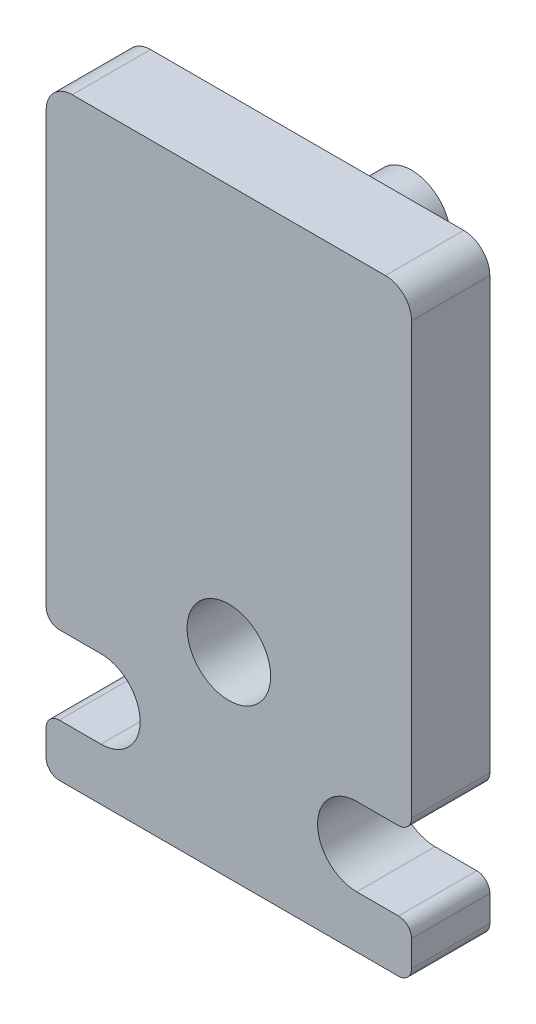
ISO-10303-21;
HEADER;
FILE_DESCRIPTION(('STEP AP214'),'2;1');
FILE_NAME('part.step','',(''),(''),'','','');
FILE_SCHEMA(('AUTOMOTIVE_DESIGN { 1 0 10303 214 1 1 1 1 }'));
ENDSEC;
DATA;
#1=APPLICATION_CONTEXT('core data for automotive mechanical design processes');
#2=APPLICATION_PROTOCOL_DEFINITION('international standard','automotive_design',2000,#1);
#3=PRODUCT_CONTEXT('',#1,'mechanical');
#4=PRODUCT('Part','Part','',(#3));
#5=PRODUCT_RELATED_PRODUCT_CATEGORY('part','',(#4));
#6=PRODUCT_DEFINITION_FORMATION('','',#4);
#7=PRODUCT_DEFINITION_CONTEXT('part definition',#1,'design');
#8=PRODUCT_DEFINITION('design','',#6,#7);
#9=PRODUCT_DEFINITION_SHAPE('','',#8);
#10=(LENGTH_UNIT() NAMED_UNIT(*) SI_UNIT(.MILLI.,.METRE.));
#11=(NAMED_UNIT(*) PLANE_ANGLE_UNIT() SI_UNIT($,.RADIAN.));
#12=(NAMED_UNIT(*) SI_UNIT($,.STERADIAN.) SOLID_ANGLE_UNIT());
#13=UNCERTAINTY_MEASURE_WITH_UNIT(LENGTH_MEASURE(1.E-05),#10,'distance_accuracy_value','');
#14=(GEOMETRIC_REPRESENTATION_CONTEXT(3) GLOBAL_UNCERTAINTY_ASSIGNED_CONTEXT((#13)) GLOBAL_UNIT_ASSIGNED_CONTEXT((#10,
#11,#12)) REPRESENTATION_CONTEXT('',''));
#15=CARTESIAN_POINT('',(0.,0.,0.));
#16=DIRECTION('',(0.,0.,1.));
#17=DIRECTION('',(1.,0.,0.));
#18=AXIS2_PLACEMENT_3D('',#15,#16,#17);
#19=CARTESIAN_POINT('',(-4.90000000000001,-8.00000000000001,1.5));
#20=DIRECTION('',(0.,0.,1.));
#21=DIRECTION('',(1.,0.,0.));
#22=AXIS2_PLACEMENT_3D('',#19,#20,#21);
#23=PLANE('',#22);
#24=DIRECTION('',(1.,0.,0.));
#25=VECTOR('',#24,1.);
#26=CARTESIAN_POINT('',(-7.,-11.5,1.5));
#27=LINE('',#26,#25);
#28=CARTESIAN_POINT('',(-6.5,-11.5,1.5));
#29=VERTEX_POINT('',#28);
#30=CARTESIAN_POINT('',(6.5,-11.5,1.5));
#31=VERTEX_POINT('',#30);
#32=EDGE_CURVE('E220',#29,#31,#27,.T.);
#33=ORIENTED_EDGE('',*,*,#32,.T.);
#34=CARTESIAN_POINT('',(6.5,-11.,1.5));
#35=DIRECTION('',(0.,0.,1.));
#36=DIRECTION('',(1.,0.,0.));
#37=AXIS2_PLACEMENT_3D('',#34,#35,#36);
#38=CIRCLE('',#37,0.5);
#39=CARTESIAN_POINT('',(7.,-11.,1.5));
#40=VERTEX_POINT('',#39);
#41=EDGE_CURVE('E308',#31,#40,#38,.T.);
#42=ORIENTED_EDGE('',*,*,#41,.T.);
#43=DIRECTION('',(0.,1.,0.));
#44=VECTOR('',#43,1.);
#45=CARTESIAN_POINT('',(7.,-9.5,1.5));
#46=LINE('',#45,#44);
#47=CARTESIAN_POINT('',(7.,-10.,1.5));
#48=VERTEX_POINT('',#47);
#49=EDGE_CURVE('E183',#40,#48,#46,.T.);
#50=ORIENTED_EDGE('',*,*,#49,.T.);
#51=CARTESIAN_POINT('',(6.5,-10.,1.5));
#52=DIRECTION('',(0.,0.,1.));
#53=DIRECTION('',(1.,0.,0.));
#54=AXIS2_PLACEMENT_3D('',#51,#52,#53);
#55=CIRCLE('',#54,0.5);
#56=CARTESIAN_POINT('',(6.5,-9.5,1.5));
#57=VERTEX_POINT('',#56);
#58=EDGE_CURVE('E179',#48,#57,#55,.T.);
#59=ORIENTED_EDGE('',*,*,#58,.T.);
#60=DIRECTION('',(-1.,0.,0.));
#61=VECTOR('',#60,1.);
#62=CARTESIAN_POINT('',(4.90000000000001,-9.5,1.5));
#63=LINE('',#62,#61);
#64=CARTESIAN_POINT('',(4.90000000000001,-9.5,1.5));
#65=VERTEX_POINT('',#64);
#66=EDGE_CURVE('E170',#57,#65,#63,.T.);
#67=ORIENTED_EDGE('',*,*,#66,.T.);
#68=CARTESIAN_POINT('',(4.89999999999999,-8.,1.5));
#69=DIRECTION('',(0.,0.,-1.));
#70=DIRECTION('',(1.,0.,0.));
#71=AXIS2_PLACEMENT_3D('',#68,#69,#70);
#72=CIRCLE('',#71,1.5);
#73=CARTESIAN_POINT('',(4.90000000000001,-6.5,1.5));
#74=VERTEX_POINT('',#73);
#75=EDGE_CURVE('E175',#65,#74,#72,.T.);
#76=ORIENTED_EDGE('',*,*,#75,.T.);
#77=DIRECTION('',(1.,0.,0.));
#78=VECTOR('',#77,1.);
#79=CARTESIAN_POINT('',(4.90000000000001,-6.5,1.5));
#80=LINE('',#79,#78);
#81=CARTESIAN_POINT('',(6.5,-6.5,1.5));
#82=VERTEX_POINT('',#81);
#83=EDGE_CURVE('E197',#74,#82,#80,.T.);
#84=ORIENTED_EDGE('',*,*,#83,.T.);
#85=CARTESIAN_POINT('',(6.5,-6.,1.5));
#86=DIRECTION('',(0.,0.,1.));
#87=DIRECTION('',(1.,0.,0.));
#88=AXIS2_PLACEMENT_3D('',#85,#86,#87);
#89=CIRCLE('',#88,0.5);
#90=CARTESIAN_POINT('',(7.,-6.,1.5));
#91=VERTEX_POINT('',#90);
#92=EDGE_CURVE('E48',#82,#91,#89,.T.);
#93=ORIENTED_EDGE('',*,*,#92,.T.);
#94=DIRECTION('',(0.,1.,0.));
#95=VECTOR('',#94,1.);
#96=CARTESIAN_POINT('',(7.,11.5,1.5));
#97=LINE('',#96,#95);
#98=CARTESIAN_POINT('',(7.,10.5,1.5));
#99=VERTEX_POINT('',#98);
#100=EDGE_CURVE('E199',#91,#99,#97,.T.);
#101=ORIENTED_EDGE('',*,*,#100,.T.);
#102=CARTESIAN_POINT('',(6.,10.5,1.5));
#103=DIRECTION('',(0.,0.,1.));
#104=DIRECTION('',(1.,0.,0.));
#105=AXIS2_PLACEMENT_3D('',#102,#103,#104);
#106=CIRCLE('',#105,1.);
#107=CARTESIAN_POINT('',(6.,11.5,1.5));
#108=VERTEX_POINT('',#107);
#109=EDGE_CURVE('E271',#99,#108,#106,.T.);
#110=ORIENTED_EDGE('',*,*,#109,.T.);
#111=DIRECTION('',(-1.,0.,0.));
#112=VECTOR('',#111,1.);
#113=CARTESIAN_POINT('',(3.,11.5,1.5));
#114=LINE('',#113,#112);
#115=CARTESIAN_POINT('',(-6.,11.5,1.5));
#116=VERTEX_POINT('',#115);
#117=EDGE_CURVE('E204',#108,#116,#114,.T.);
#118=ORIENTED_EDGE('',*,*,#117,.T.);
#119=CARTESIAN_POINT('',(-6.,10.5,1.5));
#120=DIRECTION('',(0.,0.,1.));
#121=DIRECTION('',(1.,0.,0.));
#122=AXIS2_PLACEMENT_3D('',#119,#120,#121);
#123=CIRCLE('',#122,1.);
#124=CARTESIAN_POINT('',(-7.,10.5,1.5));
#125=VERTEX_POINT('',#124);
#126=EDGE_CURVE('E273',#116,#125,#123,.T.);
#127=ORIENTED_EDGE('',*,*,#126,.T.);
#128=DIRECTION('',(0.,-1.,0.));
#129=VECTOR('',#128,1.);
#130=CARTESIAN_POINT('',(-7.,11.5,1.5));
#131=LINE('',#130,#129);
#132=CARTESIAN_POINT('',(-7.,-5.99999999999999,1.5));
#133=VERTEX_POINT('',#132);
#134=EDGE_CURVE('E207',#125,#133,#131,.T.);
#135=ORIENTED_EDGE('',*,*,#134,.T.);
#136=CARTESIAN_POINT('',(-6.5,-5.99999999999999,1.5));
#137=DIRECTION('',(0.,0.,1.));
#138=DIRECTION('',(1.,0.,0.));
#139=AXIS2_PLACEMENT_3D('',#136,#137,#138);
#140=CIRCLE('',#139,0.5);
#141=CARTESIAN_POINT('',(-6.5,-6.5,1.5));
#142=VERTEX_POINT('',#141);
#143=EDGE_CURVE('E300',#133,#142,#140,.T.);
#144=ORIENTED_EDGE('',*,*,#143,.T.);
#145=DIRECTION('',(1.,0.,0.));
#146=VECTOR('',#145,1.);
#147=CARTESIAN_POINT('',(-4.90000000000001,-6.5,1.5));
#148=LINE('',#147,#146);
#149=CARTESIAN_POINT('',(-4.90000000000001,-6.5,1.5));
#150=VERTEX_POINT('',#149);
#151=EDGE_CURVE('E210',#142,#150,#148,.T.);
#152=ORIENTED_EDGE('',*,*,#151,.T.);
#153=CARTESIAN_POINT('',(-4.90000000000001,-8.00000000000001,1.5));
#154=DIRECTION('',(0.,0.,-1.));
#155=DIRECTION('',(1.,0.,0.));
#156=AXIS2_PLACEMENT_3D('',#153,#154,#155);
#157=CIRCLE('',#156,1.5);
#158=CARTESIAN_POINT('',(-4.90000000000001,-9.50000000000001,1.5));
#159=VERTEX_POINT('',#158);
#160=EDGE_CURVE('E212',#150,#159,#157,.T.);
#161=ORIENTED_EDGE('',*,*,#160,.T.);
#162=DIRECTION('',(-1.,0.,0.));
#163=VECTOR('',#162,1.);
#164=CARTESIAN_POINT('',(-4.90000000000001,-9.50000000000001,1.5));
#165=LINE('',#164,#163);
#166=CARTESIAN_POINT('',(-6.5,-9.50000000000001,1.5));
#167=VERTEX_POINT('',#166);
#168=EDGE_CURVE('E214',#159,#167,#165,.T.);
#169=ORIENTED_EDGE('',*,*,#168,.T.);
#170=CARTESIAN_POINT('',(-6.5,-10.,1.5));
#171=DIRECTION('',(0.,0.,1.));
#172=DIRECTION('',(1.,0.,0.));
#173=AXIS2_PLACEMENT_3D('',#170,#171,#172);
#174=CIRCLE('',#173,0.5);
#175=CARTESIAN_POINT('',(-7.,-10.,1.5));
#176=VERTEX_POINT('',#175);
#177=EDGE_CURVE('E302',#167,#176,#174,.T.);
#178=ORIENTED_EDGE('',*,*,#177,.T.);
#179=DIRECTION('',(0.,-1.,0.));
#180=VECTOR('',#179,1.);
#181=CARTESIAN_POINT('',(-7.,-9.50000000000001,1.5));
#182=LINE('',#181,#180);
#183=CARTESIAN_POINT('',(-7.,-11.,1.5));
#184=VERTEX_POINT('',#183);
#185=EDGE_CURVE('E217',#176,#184,#182,.T.);
#186=ORIENTED_EDGE('',*,*,#185,.T.);
#187=CARTESIAN_POINT('',(-6.5,-11.,1.5));
#188=DIRECTION('',(0.,0.,1.));
#189=DIRECTION('',(1.,0.,0.));
#190=AXIS2_PLACEMENT_3D('',#187,#188,#189);
#191=CIRCLE('',#190,0.5);
#192=EDGE_CURVE('E306',#184,#29,#191,.T.);
#193=ORIENTED_EDGE('',*,*,#192,.T.);
#194=EDGE_LOOP('',(#33,#42,#50,#59,#67,#76,#84,#93,#101,#110,#118,#127,#135,#144,#152,#161,#169,
#178,#186,#193));
#195=FACE_BOUND('',#194,.T.);
#196=CARTESIAN_POINT('',(0.,-4.,1.5));
#197=DIRECTION('',(0.,0.,1.));
#198=DIRECTION('',(1.,0.,0.));
#199=AXIS2_PLACEMENT_3D('',#196,#197,#198);
#200=CIRCLE('',#199,1.6);
#201=CARTESIAN_POINT('',(1.6,-4.,1.5));
#202=VERTEX_POINT('',#201);
#203=EDGE_CURVE('E226',#202,#202,#200,.T.);
#204=ORIENTED_EDGE('',*,*,#203,.F.);
#205=EDGE_LOOP('',(#204));
#206=FACE_BOUND('',#205,.T.);
#207=ADVANCED_FACE('F33',(#195,#206),#23,.T.);
#208=CARTESIAN_POINT('',(-4.90000000000001,-8.00000000000001,-1.5));
#209=DIRECTION('',(0.,0.,1.));
#210=DIRECTION('',(1.,0.,0.));
#211=AXIS2_PLACEMENT_3D('',#208,#209,#210);
#212=PLANE('',#211);
#213=CARTESIAN_POINT('',(0.,7.,-1.5));
#214=DIRECTION('',(0.,0.,1.));
#215=DIRECTION('',(1.,0.,0.));
#216=AXIS2_PLACEMENT_3D('',#213,#214,#215);
#217=CIRCLE('',#216,1.5);
#218=CARTESIAN_POINT('',(1.5,7.,-1.5));
#219=VERTEX_POINT('',#218);
#220=EDGE_CURVE('E11',#219,#219,#217,.F.);
#221=ORIENTED_EDGE('',*,*,#220,.F.);
#222=EDGE_LOOP('',(#221));
#223=FACE_BOUND('',#222,.T.);
#224=DIRECTION('',(0.,1.,0.));
#225=VECTOR('',#224,1.);
#226=CARTESIAN_POINT('',(7.,-9.5,-1.5));
#227=LINE('',#226,#225);
#228=CARTESIAN_POINT('',(7.,-11.,-1.5));
#229=VERTEX_POINT('',#228);
#230=CARTESIAN_POINT('',(7.,-10.,-1.5));
#231=VERTEX_POINT('',#230);
#232=EDGE_CURVE('E223',#229,#231,#227,.T.);
#233=ORIENTED_EDGE('',*,*,#232,.F.);
#234=CARTESIAN_POINT('',(6.5,-11.,-1.5));
#235=DIRECTION('',(0.,0.,1.));
#236=DIRECTION('',(1.,0.,0.));
#237=AXIS2_PLACEMENT_3D('',#234,#235,#236);
#238=CIRCLE('',#237,0.5);
#239=CARTESIAN_POINT('',(6.5,-11.5,-1.5));
#240=VERTEX_POINT('',#239);
#241=EDGE_CURVE('E293',#229,#240,#238,.F.);
#242=ORIENTED_EDGE('',*,*,#241,.T.);
#243=DIRECTION('',(1.,0.,0.));
#244=VECTOR('',#243,1.);
#245=CARTESIAN_POINT('',(-7.,-11.5,-1.5));
#246=LINE('',#245,#244);
#247=CARTESIAN_POINT('',(-6.5,-11.5,-1.5));
#248=VERTEX_POINT('',#247);
#249=EDGE_CURVE('E250',#248,#240,#246,.T.);
#250=ORIENTED_EDGE('',*,*,#249,.F.);
#251=CARTESIAN_POINT('',(-6.5,-11.,-1.5));
#252=DIRECTION('',(0.,0.,1.));
#253=DIRECTION('',(1.,0.,0.));
#254=AXIS2_PLACEMENT_3D('',#251,#252,#253);
#255=CIRCLE('',#254,0.5);
#256=CARTESIAN_POINT('',(-7.,-11.,-1.5));
#257=VERTEX_POINT('',#256);
#258=EDGE_CURVE('E291',#248,#257,#255,.F.);
#259=ORIENTED_EDGE('',*,*,#258,.T.);
#260=DIRECTION('',(0.,-1.,0.));
#261=VECTOR('',#260,1.);
#262=CARTESIAN_POINT('',(-7.,-9.50000000000001,-1.5));
#263=LINE('',#262,#261);
#264=CARTESIAN_POINT('',(-7.,-10.,-1.5));
#265=VERTEX_POINT('',#264);
#266=EDGE_CURVE('E247',#265,#257,#263,.T.);
#267=ORIENTED_EDGE('',*,*,#266,.F.);
#268=CARTESIAN_POINT('',(-6.5,-10.,-1.5));
#269=DIRECTION('',(0.,0.,1.));
#270=DIRECTION('',(1.,0.,0.));
#271=AXIS2_PLACEMENT_3D('',#268,#269,#270);
#272=CIRCLE('',#271,0.5);
#273=CARTESIAN_POINT('',(-6.5,-9.50000000000001,-1.5));
#274=VERTEX_POINT('',#273);
#275=EDGE_CURVE('E285',#265,#274,#272,.F.);
#276=ORIENTED_EDGE('',*,*,#275,.T.);
#277=DIRECTION('',(-1.,0.,0.));
#278=VECTOR('',#277,1.);
#279=CARTESIAN_POINT('',(-4.90000000000001,-9.50000000000001,-1.5));
#280=LINE('',#279,#278);
#281=CARTESIAN_POINT('',(-4.90000000000001,-9.50000000000001,-1.5));
#282=VERTEX_POINT('',#281);
#283=EDGE_CURVE('E244',#282,#274,#280,.T.);
#284=ORIENTED_EDGE('',*,*,#283,.F.);
#285=CARTESIAN_POINT('',(-4.90000000000001,-8.00000000000001,-1.5));
#286=DIRECTION('',(0.,0.,-1.));
#287=DIRECTION('',(1.,0.,0.));
#288=AXIS2_PLACEMENT_3D('',#285,#286,#287);
#289=CIRCLE('',#288,1.5);
#290=CARTESIAN_POINT('',(-4.90000000000001,-6.5,-1.5));
#291=VERTEX_POINT('',#290);
#292=EDGE_CURVE('E242',#291,#282,#289,.T.);
#293=ORIENTED_EDGE('',*,*,#292,.F.);
#294=DIRECTION('',(1.,0.,0.));
#295=VECTOR('',#294,1.);
#296=CARTESIAN_POINT('',(-4.90000000000001,-6.5,-1.5));
#297=LINE('',#296,#295);
#298=CARTESIAN_POINT('',(-6.5,-6.5,-1.5));
#299=VERTEX_POINT('',#298);
#300=EDGE_CURVE('E240',#299,#291,#297,.T.);
#301=ORIENTED_EDGE('',*,*,#300,.F.);
#302=CARTESIAN_POINT('',(-6.5,-5.99999999999999,-1.5));
#303=DIRECTION('',(0.,0.,1.));
#304=DIRECTION('',(1.,0.,0.));
#305=AXIS2_PLACEMENT_3D('',#302,#303,#304);
#306=CIRCLE('',#305,0.5);
#307=CARTESIAN_POINT('',(-7.,-5.99999999999999,-1.5));
#308=VERTEX_POINT('',#307);
#309=EDGE_CURVE('E283',#299,#308,#306,.F.);
#310=ORIENTED_EDGE('',*,*,#309,.T.);
#311=DIRECTION('',(0.,-1.,0.));
#312=VECTOR('',#311,1.);
#313=CARTESIAN_POINT('',(-7.,11.5,-1.5));
#314=LINE('',#313,#312);
#315=CARTESIAN_POINT('',(-7.,10.5,-1.5));
#316=VERTEX_POINT('',#315);
#317=EDGE_CURVE('E237',#316,#308,#314,.T.);
#318=ORIENTED_EDGE('',*,*,#317,.F.);
#319=CARTESIAN_POINT('',(-6.,10.5,-1.5));
#320=DIRECTION('',(0.,0.,1.));
#321=DIRECTION('',(1.,0.,0.));
#322=AXIS2_PLACEMENT_3D('',#319,#320,#321);
#323=CIRCLE('',#322,1.);
#324=CARTESIAN_POINT('',(-6.,11.5,-1.5));
#325=VERTEX_POINT('',#324);
#326=EDGE_CURVE('E264',#316,#325,#323,.F.);
#327=ORIENTED_EDGE('',*,*,#326,.T.);
#328=DIRECTION('',(-1.,0.,0.));
#329=VECTOR('',#328,1.);
#330=CARTESIAN_POINT('',(-7.,11.5,-1.5));
#331=LINE('',#330,#329);
#332=CARTESIAN_POINT('',(6.,11.5,-1.5));
#333=VERTEX_POINT('',#332);
#334=EDGE_CURVE('E234',#333,#325,#331,.T.);
#335=ORIENTED_EDGE('',*,*,#334,.F.);
#336=CARTESIAN_POINT('',(6.,10.5,-1.5));
#337=DIRECTION('',(0.,0.,1.));
#338=DIRECTION('',(1.,0.,0.));
#339=AXIS2_PLACEMENT_3D('',#336,#337,#338);
#340=CIRCLE('',#339,1.);
#341=CARTESIAN_POINT('',(7.,10.5,-1.5));
#342=VERTEX_POINT('',#341);
#343=EDGE_CURVE('E261',#333,#342,#340,.F.);
#344=ORIENTED_EDGE('',*,*,#343,.T.);
#345=DIRECTION('',(0.,1.,0.));
#346=VECTOR('',#345,1.);
#347=CARTESIAN_POINT('',(7.,11.5,-1.5));
#348=LINE('',#347,#346);
#349=CARTESIAN_POINT('',(7.,-6.,-1.5));
#350=VERTEX_POINT('',#349);
#351=EDGE_CURVE('E232',#350,#342,#348,.T.);
#352=ORIENTED_EDGE('',*,*,#351,.F.);
#353=CARTESIAN_POINT('',(6.5,-6.,-1.5));
#354=DIRECTION('',(0.,0.,1.));
#355=DIRECTION('',(1.,0.,0.));
#356=AXIS2_PLACEMENT_3D('',#353,#354,#355);
#357=CIRCLE('',#356,0.5);
#358=CARTESIAN_POINT('',(6.5,-6.5,-1.5));
#359=VERTEX_POINT('',#358);
#360=EDGE_CURVE('E287',#350,#359,#357,.F.);
#361=ORIENTED_EDGE('',*,*,#360,.T.);
#362=DIRECTION('',(1.,0.,0.));
#363=VECTOR('',#362,1.);
#364=CARTESIAN_POINT('',(4.90000000000001,-6.5,-1.5));
#365=LINE('',#364,#363);
#366=CARTESIAN_POINT('',(4.90000000000001,-6.5,-1.5));
#367=VERTEX_POINT('',#366);
#368=EDGE_CURVE('E230',#367,#359,#365,.T.);
#369=ORIENTED_EDGE('',*,*,#368,.F.);
#370=CARTESIAN_POINT('',(4.89999999999999,-8.,-1.5));
#371=DIRECTION('',(0.,0.,-1.));
#372=DIRECTION('',(1.,0.,0.));
#373=AXIS2_PLACEMENT_3D('',#370,#371,#372);
#374=CIRCLE('',#373,1.5);
#375=CARTESIAN_POINT('',(4.90000000000001,-9.5,-1.5));
#376=VERTEX_POINT('',#375);
#377=EDGE_CURVE('E228',#376,#367,#374,.T.);
#378=ORIENTED_EDGE('',*,*,#377,.F.);
#379=DIRECTION('',(-1.,0.,0.));
#380=VECTOR('',#379,1.);
#381=CARTESIAN_POINT('',(4.90000000000001,-9.5,-1.5));
#382=LINE('',#381,#380);
#383=CARTESIAN_POINT('',(6.5,-9.5,-1.5));
#384=VERTEX_POINT('',#383);
#385=EDGE_CURVE('E189',#384,#376,#382,.T.);
#386=ORIENTED_EDGE('',*,*,#385,.F.);
#387=CARTESIAN_POINT('',(6.5,-10.,-1.5));
#388=DIRECTION('',(0.,0.,1.));
#389=DIRECTION('',(1.,0.,0.));
#390=AXIS2_PLACEMENT_3D('',#387,#388,#389);
#391=CIRCLE('',#390,0.5);
#392=EDGE_CURVE('E289',#384,#231,#391,.F.);
#393=ORIENTED_EDGE('',*,*,#392,.T.);
#394=EDGE_LOOP('',(#233,#242,#250,#259,#267,#276,#284,#293,#301,#310,#318,#327,#335,#344,#352,
#361,#369,#378,#386,#393));
#395=FACE_BOUND('',#394,.T.);
#396=CARTESIAN_POINT('',(0.,-4.,-1.5));
#397=DIRECTION('',(0.,0.,1.));
#398=DIRECTION('',(1.,0.,0.));
#399=AXIS2_PLACEMENT_3D('',#396,#397,#398);
#400=CIRCLE('',#399,1.6);
#401=CARTESIAN_POINT('',(1.6,-4.,-1.5));
#402=VERTEX_POINT('',#401);
#403=EDGE_CURVE('E383',#402,#402,#400,.T.);
#404=ORIENTED_EDGE('',*,*,#403,.T.);
#405=EDGE_LOOP('',(#404));
#406=FACE_BOUND('',#405,.T.);
#407=ADVANCED_FACE('F343',(#223,#395,#406),#212,.F.);
#408=CARTESIAN_POINT('',(7.,-9.5,1.5));
#409=DIRECTION('',(-1.,0.,0.));
#410=DIRECTION('',(0.,-1.,0.));
#411=AXIS2_PLACEMENT_3D('',#408,#409,#410);
#412=PLANE('',#411);
#413=ORIENTED_EDGE('',*,*,#49,.F.);
#414=DIRECTION('',(0.,0.,-1.));
#415=VECTOR('',#414,1.);
#416=CARTESIAN_POINT('',(7.,-11.,1.5));
#417=LINE('',#416,#415);
#418=EDGE_CURVE('E280',#40,#229,#417,.T.);
#419=ORIENTED_EDGE('',*,*,#418,.T.);
#420=ORIENTED_EDGE('',*,*,#232,.T.);
#421=DIRECTION('',(0.,0.,-1.));
#422=VECTOR('',#421,1.);
#423=CARTESIAN_POINT('',(7.,-10.,1.5));
#424=LINE('',#423,#422);
#425=EDGE_CURVE('E278',#231,#48,#424,.F.);
#426=ORIENTED_EDGE('',*,*,#425,.T.);
#427=EDGE_LOOP('',(#413,#419,#420,#426));
#428=FACE_BOUND('',#427,.T.);
#429=ADVANCED_FACE('F378',(#428),#412,.F.);
#430=CARTESIAN_POINT('',(4.90000000000001,-9.5,1.5));
#431=DIRECTION('',(0.,-1.,0.));
#432=DIRECTION('',(0.,0.,-1.));
#433=AXIS2_PLACEMENT_3D('',#430,#431,#432);
#434=PLANE('',#433);
#435=ORIENTED_EDGE('',*,*,#66,.F.);
#436=DIRECTION('',(0.,0.,-1.));
#437=VECTOR('',#436,1.);
#438=CARTESIAN_POINT('',(6.5,-9.5,1.5));
#439=LINE('',#438,#437);
#440=EDGE_CURVE('E315',#57,#384,#439,.T.);
#441=ORIENTED_EDGE('',*,*,#440,.T.);
#442=ORIENTED_EDGE('',*,*,#385,.T.);
#443=DIRECTION('',(0.,0.,-1.));
#444=VECTOR('',#443,1.);
#445=CARTESIAN_POINT('',(4.90000000000001,-9.5,1.5));
#446=LINE('',#445,#444);
#447=EDGE_CURVE('E186',#65,#376,#446,.T.);
#448=ORIENTED_EDGE('',*,*,#447,.F.);
#449=EDGE_LOOP('',(#435,#441,#442,#448));
#450=FACE_BOUND('',#449,.T.);
#451=ADVANCED_FACE('F187',(#450),#434,.F.);
#452=CARTESIAN_POINT('',(4.89999999999999,-8.,1.5));
#453=DIRECTION('',(0.,0.,-1.));
#454=DIRECTION('',(-1.,0.,0.));
#455=AXIS2_PLACEMENT_3D('',#452,#453,#454);
#456=CYLINDRICAL_SURFACE('',#455,1.5);
#457=ORIENTED_EDGE('',*,*,#377,.T.);
#458=DIRECTION('',(0.,0.,-1.));
#459=VECTOR('',#458,1.);
#460=CARTESIAN_POINT('',(4.90000000000001,-6.5,1.5));
#461=LINE('',#460,#459);
#462=EDGE_CURVE('E193',#74,#367,#461,.T.);
#463=ORIENTED_EDGE('',*,*,#462,.F.);
#464=ORIENTED_EDGE('',*,*,#75,.F.);
#465=ORIENTED_EDGE('',*,*,#447,.T.);
#466=EDGE_LOOP('',(#457,#463,#464,#465));
#467=FACE_BOUND('',#466,.T.);
#468=ADVANCED_FACE('F195',(#467),#456,.F.);
#469=CARTESIAN_POINT('',(4.90000000000001,-6.5,1.5));
#470=DIRECTION('',(0.,1.,0.));
#471=DIRECTION('',(0.,0.,1.));
#472=AXIS2_PLACEMENT_3D('',#469,#470,#471);
#473=PLANE('',#472);
#474=ORIENTED_EDGE('',*,*,#368,.T.);
#475=DIRECTION('',(0.,0.,-1.));
#476=VECTOR('',#475,1.);
#477=CARTESIAN_POINT('',(6.5,-6.5,1.5));
#478=LINE('',#477,#476);
#479=EDGE_CURVE('E56',#359,#82,#478,.F.);
#480=ORIENTED_EDGE('',*,*,#479,.T.);
#481=ORIENTED_EDGE('',*,*,#83,.F.);
#482=ORIENTED_EDGE('',*,*,#462,.T.);
#483=EDGE_LOOP('',(#474,#480,#481,#482));
#484=FACE_BOUND('',#483,.T.);
#485=ADVANCED_FACE('F430',(#484),#473,.F.);
#486=CARTESIAN_POINT('',(7.,11.5,1.5));
#487=DIRECTION('',(-1.,0.,0.));
#488=DIRECTION('',(0.,-1.,0.));
#489=AXIS2_PLACEMENT_3D('',#486,#487,#488);
#490=PLANE('',#489);
#491=ORIENTED_EDGE('',*,*,#100,.F.);
#492=DIRECTION('',(0.,0.,-1.));
#493=VECTOR('',#492,1.);
#494=CARTESIAN_POINT('',(7.,-6.,1.5));
#495=LINE('',#494,#493);
#496=EDGE_CURVE('E317',#91,#350,#495,.T.);
#497=ORIENTED_EDGE('',*,*,#496,.T.);
#498=ORIENTED_EDGE('',*,*,#351,.T.);
#499=DIRECTION('',(0.,0.,-1.));
#500=VECTOR('',#499,1.);
#501=CARTESIAN_POINT('',(7.,10.5,1.5));
#502=LINE('',#501,#500);
#503=EDGE_CURVE('E275',#342,#99,#502,.F.);
#504=ORIENTED_EDGE('',*,*,#503,.T.);
#505=EDGE_LOOP('',(#491,#497,#498,#504));
#506=FACE_BOUND('',#505,.T.);
#507=ADVANCED_FACE('F426',(#506),#490,.F.);
#508=CARTESIAN_POINT('',(-7.,11.5,1.5));
#509=DIRECTION('',(0.,-1.,0.));
#510=DIRECTION('',(0.,0.,-1.));
#511=AXIS2_PLACEMENT_3D('',#508,#509,#510);
#512=PLANE('',#511);
#513=ORIENTED_EDGE('',*,*,#334,.T.);
#514=DIRECTION('',(0.,0.,-1.));
#515=VECTOR('',#514,1.);
#516=CARTESIAN_POINT('',(-6.,11.5,1.5));
#517=LINE('',#516,#515);
#518=EDGE_CURVE('E269',#325,#116,#517,.F.);
#519=ORIENTED_EDGE('',*,*,#518,.T.);
#520=ORIENTED_EDGE('',*,*,#117,.F.);
#521=DIRECTION('',(0.,0.,-1.));
#522=VECTOR('',#521,1.);
#523=CARTESIAN_POINT('',(6.,11.5,1.5));
#524=LINE('',#523,#522);
#525=EDGE_CURVE('E266',#108,#333,#524,.T.);
#526=ORIENTED_EDGE('',*,*,#525,.T.);
#527=EDGE_LOOP('',(#513,#519,#520,#526));
#528=FACE_BOUND('',#527,.T.);
#529=ADVANCED_FACE('F423',(#528),#512,.F.);
#530=CARTESIAN_POINT('',(-7.,11.5,1.5));
#531=DIRECTION('',(1.,0.,0.));
#532=DIRECTION('',(0.,1.,0.));
#533=AXIS2_PLACEMENT_3D('',#530,#531,#532);
#534=PLANE('',#533);
#535=ORIENTED_EDGE('',*,*,#317,.T.);
#536=DIRECTION('',(0.,0.,-1.));
#537=VECTOR('',#536,1.);
#538=CARTESIAN_POINT('',(-7.,-5.99999999999999,1.5));
#539=LINE('',#538,#537);
#540=EDGE_CURVE('E41',#308,#133,#539,.F.);
#541=ORIENTED_EDGE('',*,*,#540,.T.);
#542=ORIENTED_EDGE('',*,*,#134,.F.);
#543=DIRECTION('',(0.,0.,-1.));
#544=VECTOR('',#543,1.);
#545=CARTESIAN_POINT('',(-7.,10.5,1.5));
#546=LINE('',#545,#544);
#547=EDGE_CURVE('E192',#125,#316,#546,.T.);
#548=ORIENTED_EDGE('',*,*,#547,.T.);
#549=EDGE_LOOP('',(#535,#541,#542,#548));
#550=FACE_BOUND('',#549,.T.);
#551=ADVANCED_FACE('F328',(#550),#534,.F.);
#552=CARTESIAN_POINT('',(-4.90000000000001,-6.5,1.5));
#553=DIRECTION('',(0.,1.,0.));
#554=DIRECTION('',(0.,0.,1.));
#555=AXIS2_PLACEMENT_3D('',#552,#553,#554);
#556=PLANE('',#555);
#557=ORIENTED_EDGE('',*,*,#151,.F.);
#558=DIRECTION('',(0.,0.,-1.));
#559=VECTOR('',#558,1.);
#560=CARTESIAN_POINT('',(-6.5,-6.5,1.5));
#561=LINE('',#560,#559);
#562=EDGE_CURVE('E323',#142,#299,#561,.T.);
#563=ORIENTED_EDGE('',*,*,#562,.T.);
#564=ORIENTED_EDGE('',*,*,#300,.T.);
#565=DIRECTION('',(0.,0.,-1.));
#566=VECTOR('',#565,1.);
#567=CARTESIAN_POINT('',(-4.90000000000001,-6.5,1.5));
#568=LINE('',#567,#566);
#569=EDGE_CURVE('E255',#150,#291,#568,.T.);
#570=ORIENTED_EDGE('',*,*,#569,.F.);
#571=EDGE_LOOP('',(#557,#563,#564,#570));
#572=FACE_BOUND('',#571,.T.);
#573=ADVANCED_FACE('F338',(#572),#556,.F.);
#574=CARTESIAN_POINT('',(-4.90000000000001,-8.00000000000001,1.5));
#575=DIRECTION('',(0.,0.,-1.));
#576=DIRECTION('',(-1.,0.,0.));
#577=AXIS2_PLACEMENT_3D('',#574,#575,#576);
#578=CYLINDRICAL_SURFACE('',#577,1.5);
#579=ORIENTED_EDGE('',*,*,#292,.T.);
#580=DIRECTION('',(0.,0.,-1.));
#581=VECTOR('',#580,1.);
#582=CARTESIAN_POINT('',(-4.90000000000001,-9.50000000000001,1.5));
#583=LINE('',#582,#581);
#584=EDGE_CURVE('E222',#159,#282,#583,.T.);
#585=ORIENTED_EDGE('',*,*,#584,.F.);
#586=ORIENTED_EDGE('',*,*,#160,.F.);
#587=ORIENTED_EDGE('',*,*,#569,.T.);
#588=EDGE_LOOP('',(#579,#585,#586,#587));
#589=FACE_BOUND('',#588,.T.);
#590=ADVANCED_FACE('F348',(#589),#578,.F.);
#591=CARTESIAN_POINT('',(-4.90000000000001,-9.50000000000001,1.5));
#592=DIRECTION('',(0.,-1.,0.));
#593=DIRECTION('',(0.,0.,-1.));
#594=AXIS2_PLACEMENT_3D('',#591,#592,#593);
#595=PLANE('',#594);
#596=ORIENTED_EDGE('',*,*,#283,.T.);
#597=DIRECTION('',(0.,0.,-1.));
#598=VECTOR('',#597,1.);
#599=CARTESIAN_POINT('',(-6.5,-9.50000000000001,1.5));
#600=LINE('',#599,#598);
#601=EDGE_CURVE('E321',#274,#167,#600,.F.);
#602=ORIENTED_EDGE('',*,*,#601,.T.);
#603=ORIENTED_EDGE('',*,*,#168,.F.);
#604=ORIENTED_EDGE('',*,*,#584,.T.);
#605=EDGE_LOOP('',(#596,#602,#603,#604));
#606=FACE_BOUND('',#605,.T.);
#607=ADVANCED_FACE('F352',(#606),#595,.F.);
#608=CARTESIAN_POINT('',(-7.,-9.50000000000001,1.5));
#609=DIRECTION('',(1.,0.,0.));
#610=DIRECTION('',(0.,1.,0.));
#611=AXIS2_PLACEMENT_3D('',#608,#609,#610);
#612=PLANE('',#611);
#613=ORIENTED_EDGE('',*,*,#266,.T.);
#614=DIRECTION('',(0.,0.,-1.));
#615=VECTOR('',#614,1.);
#616=CARTESIAN_POINT('',(-7.,-11.,1.5));
#617=LINE('',#616,#615);
#618=EDGE_CURVE('E313',#257,#184,#617,.F.);
#619=ORIENTED_EDGE('',*,*,#618,.T.);
#620=ORIENTED_EDGE('',*,*,#185,.F.);
#621=DIRECTION('',(0.,0.,-1.));
#622=VECTOR('',#621,1.);
#623=CARTESIAN_POINT('',(-7.,-10.,1.5));
#624=LINE('',#623,#622);
#625=EDGE_CURVE('E310',#176,#265,#624,.T.);
#626=ORIENTED_EDGE('',*,*,#625,.T.);
#627=EDGE_LOOP('',(#613,#619,#620,#626));
#628=FACE_BOUND('',#627,.T.);
#629=ADVANCED_FACE('F361',(#628),#612,.F.);
#630=CARTESIAN_POINT('',(-7.,-11.5,1.5));
#631=DIRECTION('',(0.,1.,0.));
#632=DIRECTION('',(-1.,0.,0.));
#633=AXIS2_PLACEMENT_3D('',#630,#631,#632);
#634=PLANE('',#633);
#635=ORIENTED_EDGE('',*,*,#249,.T.);
#636=DIRECTION('',(0.,0.,-1.));
#637=VECTOR('',#636,1.);
#638=CARTESIAN_POINT('',(6.5,-11.5,1.5));
#639=LINE('',#638,#637);
#640=EDGE_CURVE('E298',#240,#31,#639,.F.);
#641=ORIENTED_EDGE('',*,*,#640,.T.);
#642=ORIENTED_EDGE('',*,*,#32,.F.);
#643=DIRECTION('',(0.,0.,-1.));
#644=VECTOR('',#643,1.);
#645=CARTESIAN_POINT('',(-6.5,-11.5,1.5));
#646=LINE('',#645,#644);
#647=EDGE_CURVE('E295',#29,#248,#646,.T.);
#648=ORIENTED_EDGE('',*,*,#647,.T.);
#649=EDGE_LOOP('',(#635,#641,#642,#648));
#650=FACE_BOUND('',#649,.T.);
#651=ADVANCED_FACE('F370',(#650),#634,.F.);
#652=CARTESIAN_POINT('',(0.,-4.,1.5));
#653=DIRECTION('',(0.,0.,-1.));
#654=DIRECTION('',(-1.,0.,0.));
#655=AXIS2_PLACEMENT_3D('',#652,#653,#654);
#656=CYLINDRICAL_SURFACE('',#655,1.6);
#657=ORIENTED_EDGE('',*,*,#203,.T.);
#658=EDGE_LOOP('',(#657));
#659=FACE_BOUND('',#658,.T.);
#660=ORIENTED_EDGE('',*,*,#403,.F.);
#661=EDGE_LOOP('',(#660));
#662=FACE_BOUND('',#661,.T.);
#663=ADVANCED_FACE('F412',(#659,#662),#656,.F.);
#664=CARTESIAN_POINT('',(-6.,10.5,1.5));
#665=DIRECTION('',(0.,0.,-1.));
#666=DIRECTION('',(-1.,0.,0.));
#667=AXIS2_PLACEMENT_3D('',#664,#665,#666);
#668=CYLINDRICAL_SURFACE('',#667,1.);
#669=ORIENTED_EDGE('',*,*,#126,.F.);
#670=ORIENTED_EDGE('',*,*,#518,.F.);
#671=ORIENTED_EDGE('',*,*,#326,.F.);
#672=ORIENTED_EDGE('',*,*,#547,.F.);
#673=EDGE_LOOP('',(#669,#670,#671,#672));
#674=FACE_BOUND('',#673,.T.);
#675=ADVANCED_FACE('F438',(#674),#668,.T.);
#676=CARTESIAN_POINT('',(6.,10.5,1.5));
#677=DIRECTION('',(0.,0.,-1.));
#678=DIRECTION('',(-1.,0.,0.));
#679=AXIS2_PLACEMENT_3D('',#676,#677,#678);
#680=CYLINDRICAL_SURFACE('',#679,1.);
#681=ORIENTED_EDGE('',*,*,#109,.F.);
#682=ORIENTED_EDGE('',*,*,#503,.F.);
#683=ORIENTED_EDGE('',*,*,#343,.F.);
#684=ORIENTED_EDGE('',*,*,#525,.F.);
#685=EDGE_LOOP('',(#681,#682,#683,#684));
#686=FACE_BOUND('',#685,.T.);
#687=ADVANCED_FACE('F441',(#686),#680,.T.);
#688=CARTESIAN_POINT('',(6.5,-11.,1.5));
#689=DIRECTION('',(0.,0.,-1.));
#690=DIRECTION('',(-1.,0.,0.));
#691=AXIS2_PLACEMENT_3D('',#688,#689,#690);
#692=CYLINDRICAL_SURFACE('',#691,0.5);
#693=ORIENTED_EDGE('',*,*,#41,.F.);
#694=ORIENTED_EDGE('',*,*,#640,.F.);
#695=ORIENTED_EDGE('',*,*,#241,.F.);
#696=ORIENTED_EDGE('',*,*,#418,.F.);
#697=EDGE_LOOP('',(#693,#694,#695,#696));
#698=FACE_BOUND('',#697,.T.);
#699=ADVANCED_FACE('F376',(#698),#692,.T.);
#700=CARTESIAN_POINT('',(-6.5,-11.,1.5));
#701=DIRECTION('',(0.,0.,-1.));
#702=DIRECTION('',(-1.,0.,0.));
#703=AXIS2_PLACEMENT_3D('',#700,#701,#702);
#704=CYLINDRICAL_SURFACE('',#703,0.5);
#705=ORIENTED_EDGE('',*,*,#192,.F.);
#706=ORIENTED_EDGE('',*,*,#618,.F.);
#707=ORIENTED_EDGE('',*,*,#258,.F.);
#708=ORIENTED_EDGE('',*,*,#647,.F.);
#709=EDGE_LOOP('',(#705,#706,#707,#708));
#710=FACE_BOUND('',#709,.T.);
#711=ADVANCED_FACE('F367',(#710),#704,.T.);
#712=CARTESIAN_POINT('',(6.5,-10.,1.5));
#713=DIRECTION('',(0.,0.,-1.));
#714=DIRECTION('',(-1.,0.,0.));
#715=AXIS2_PLACEMENT_3D('',#712,#713,#714);
#716=CYLINDRICAL_SURFACE('',#715,0.5);
#717=ORIENTED_EDGE('',*,*,#58,.F.);
#718=ORIENTED_EDGE('',*,*,#425,.F.);
#719=ORIENTED_EDGE('',*,*,#392,.F.);
#720=ORIENTED_EDGE('',*,*,#440,.F.);
#721=EDGE_LOOP('',(#717,#718,#719,#720));
#722=FACE_BOUND('',#721,.T.);
#723=ADVANCED_FACE('F381',(#722),#716,.T.);
#724=CARTESIAN_POINT('',(6.5,-6.,1.5));
#725=DIRECTION('',(0.,0.,-1.));
#726=DIRECTION('',(-1.,0.,0.));
#727=AXIS2_PLACEMENT_3D('',#724,#725,#726);
#728=CYLINDRICAL_SURFACE('',#727,0.5);
#729=ORIENTED_EDGE('',*,*,#92,.F.);
#730=ORIENTED_EDGE('',*,*,#479,.F.);
#731=ORIENTED_EDGE('',*,*,#360,.F.);
#732=ORIENTED_EDGE('',*,*,#496,.F.);
#733=EDGE_LOOP('',(#729,#730,#731,#732));
#734=FACE_BOUND('',#733,.T.);
#735=ADVANCED_FACE('F452',(#734),#728,.T.);
#736=CARTESIAN_POINT('',(-6.5,-10.,1.5));
#737=DIRECTION('',(0.,0.,-1.));
#738=DIRECTION('',(-1.,0.,0.));
#739=AXIS2_PLACEMENT_3D('',#736,#737,#738);
#740=CYLINDRICAL_SURFACE('',#739,0.5);
#741=ORIENTED_EDGE('',*,*,#177,.F.);
#742=ORIENTED_EDGE('',*,*,#601,.F.);
#743=ORIENTED_EDGE('',*,*,#275,.F.);
#744=ORIENTED_EDGE('',*,*,#625,.F.);
#745=EDGE_LOOP('',(#741,#742,#743,#744));
#746=FACE_BOUND('',#745,.T.);
#747=ADVANCED_FACE('F358',(#746),#740,.T.);
#748=CARTESIAN_POINT('',(-6.5,-5.99999999999999,1.5));
#749=DIRECTION('',(0.,0.,-1.));
#750=DIRECTION('',(-1.,0.,0.));
#751=AXIS2_PLACEMENT_3D('',#748,#749,#750);
#752=CYLINDRICAL_SURFACE('',#751,0.5);
#753=ORIENTED_EDGE('',*,*,#143,.F.);
#754=ORIENTED_EDGE('',*,*,#540,.F.);
#755=ORIENTED_EDGE('',*,*,#309,.F.);
#756=ORIENTED_EDGE('',*,*,#562,.F.);
#757=EDGE_LOOP('',(#753,#754,#755,#756));
#758=FACE_BOUND('',#757,.T.);
#759=ADVANCED_FACE('F35',(#758),#752,.T.);
#760=CARTESIAN_POINT('',(0.,7.,-5.5));
#761=DIRECTION('',(0.,0.,1.));
#762=DIRECTION('',(1.,0.,0.));
#763=AXIS2_PLACEMENT_3D('',#760,#761,#762);
#764=CYLINDRICAL_SURFACE('',#763,1.5);
#765=CARTESIAN_POINT('',(0.,7.,-5.5));
#766=DIRECTION('',(0.,0.,-1.));
#767=DIRECTION('',(-1.,0.,0.));
#768=AXIS2_PLACEMENT_3D('',#765,#766,#767);
#769=CIRCLE('',#768,1.5);
#770=CARTESIAN_POINT('',(-1.5,7.,-5.5));
#771=VERTEX_POINT('',#770);
#772=EDGE_CURVE('E386',#771,#771,#769,.T.);
#773=ORIENTED_EDGE('',*,*,#772,.F.);
#774=EDGE_LOOP('',(#773));
#775=FACE_BOUND('',#774,.T.);
#776=ORIENTED_EDGE('',*,*,#220,.T.);
#777=EDGE_LOOP('',(#776));
#778=FACE_BOUND('',#777,.T.);
#779=ADVANCED_FACE('F394',(#775,#778),#764,.T.);
#780=CARTESIAN_POINT('',(0.,7.,-5.5));
#781=DIRECTION('',(0.,0.,-1.));
#782=DIRECTION('',(-1.,0.,0.));
#783=AXIS2_PLACEMENT_3D('',#780,#781,#782);
#784=PLANE('',#783);
#785=ORIENTED_EDGE('',*,*,#772,.T.);
#786=EDGE_LOOP('',(#785));
#787=FACE_BOUND('',#786,.T.);
#788=ADVANCED_FACE('F392',(#787),#784,.T.);
#789=CLOSED_SHELL('',(#207,#407,#429,#451,#468,#485,#507,#529,#551,#573,#590,#607,#629,#651,
#663,#675,#687,#699,#711,#723,#735,#747,#759,#779,#788));
#790=MANIFOLD_SOLID_BREP('B2',#789);
#791=ADVANCED_BREP_SHAPE_REPRESENTATION('',(#18,#790),#14);
#792=SHAPE_DEFINITION_REPRESENTATION(#9,#791);
ENDSEC;
END-ISO-10303-21;
